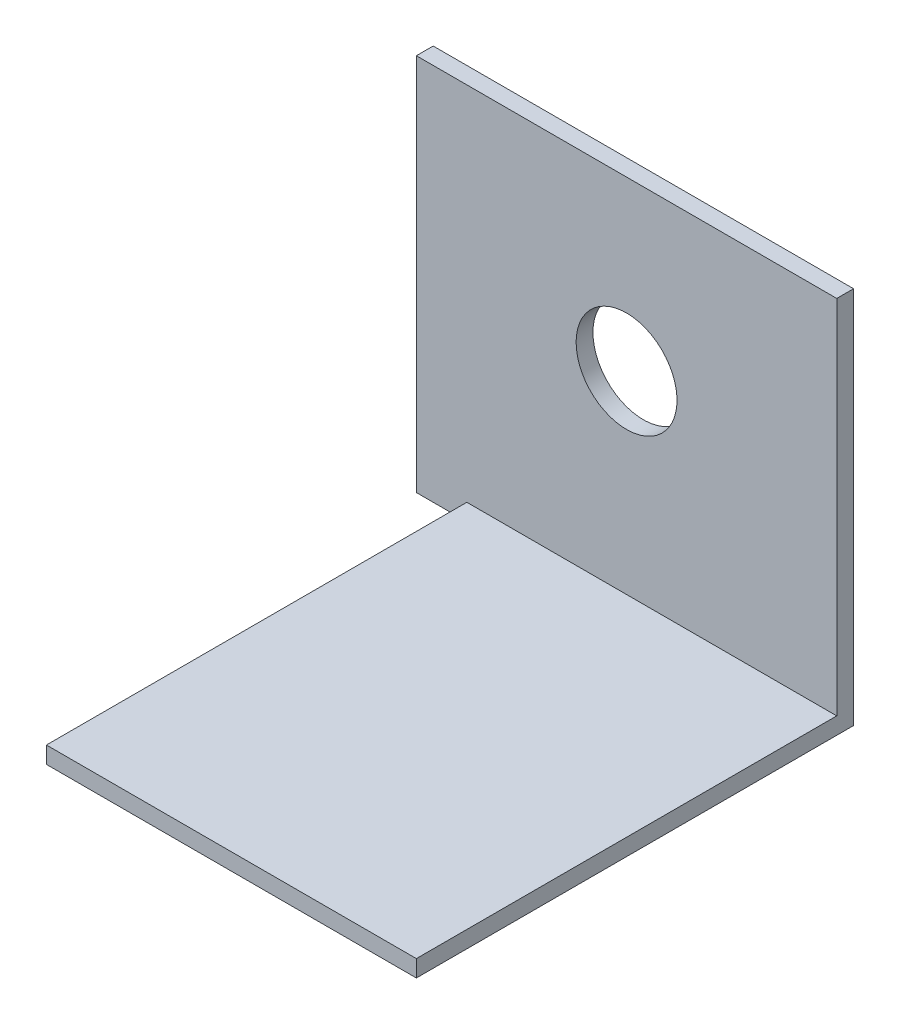
ISO-10303-21;
HEADER;
FILE_DESCRIPTION(('STEP AP214'),'2;1');
FILE_NAME('part.step','',(''),(''),'','','');
FILE_SCHEMA(('AUTOMOTIVE_DESIGN { 1 0 10303 214 1 1 1 1 }'));
ENDSEC;
DATA;
#1=APPLICATION_CONTEXT('core data for automotive mechanical design processes');
#2=APPLICATION_PROTOCOL_DEFINITION('international standard','automotive_design',2000,#1);
#3=PRODUCT_CONTEXT('',#1,'mechanical');
#4=PRODUCT('Part','Part','',(#3));
#5=PRODUCT_RELATED_PRODUCT_CATEGORY('part','',(#4));
#6=PRODUCT_DEFINITION_FORMATION('','',#4);
#7=PRODUCT_DEFINITION_CONTEXT('part definition',#1,'design');
#8=PRODUCT_DEFINITION('design','',#6,#7);
#9=PRODUCT_DEFINITION_SHAPE('','',#8);
#10=(LENGTH_UNIT() NAMED_UNIT(*) SI_UNIT(.MILLI.,.METRE.));
#11=(NAMED_UNIT(*) PLANE_ANGLE_UNIT() SI_UNIT($,.RADIAN.));
#12=(NAMED_UNIT(*) SI_UNIT($,.STERADIAN.) SOLID_ANGLE_UNIT());
#13=UNCERTAINTY_MEASURE_WITH_UNIT(LENGTH_MEASURE(1.E-05),#10,'distance_accuracy_value','');
#14=(GEOMETRIC_REPRESENTATION_CONTEXT(3) GLOBAL_UNCERTAINTY_ASSIGNED_CONTEXT((#13)) GLOBAL_UNIT_ASSIGNED_CONTEXT((#10,
#11,#12)) REPRESENTATION_CONTEXT('',''));
#15=CARTESIAN_POINT('',(0.,0.,0.));
#16=DIRECTION('',(0.,0.,1.));
#17=DIRECTION('',(1.,0.,0.));
#18=AXIS2_PLACEMENT_3D('',#15,#16,#17);
#19=CARTESIAN_POINT('',(0.,2.,0.));
#20=DIRECTION('',(1.,0.,0.));
#21=DIRECTION('',(0.,0.,-1.));
#22=AXIS2_PLACEMENT_3D('',#19,#20,#21);
#23=PLANE('',#22);
#24=DIRECTION('',(0.,0.,1.));
#25=VECTOR('',#24,1.);
#26=CARTESIAN_POINT('',(0.,0.,0.));
#27=LINE('',#26,#25);
#28=CARTESIAN_POINT('',(0.,0.,0.));
#29=VERTEX_POINT('',#28);
#30=CARTESIAN_POINT('',(0.,0.,50.));
#31=VERTEX_POINT('',#30);
#32=EDGE_CURVE('E92',#29,#31,#27,.T.);
#33=ORIENTED_EDGE('',*,*,#32,.T.);
#34=DIRECTION('',(0.,-1.,0.));
#35=VECTOR('',#34,1.);
#36=CARTESIAN_POINT('',(0.,2.,50.));
#37=LINE('',#36,#35);
#38=CARTESIAN_POINT('',(0.,2.,50.));
#39=VERTEX_POINT('',#38);
#40=EDGE_CURVE('E11',#39,#31,#37,.T.);
#41=ORIENTED_EDGE('',*,*,#40,.F.);
#42=DIRECTION('',(0.,0.,1.));
#43=VECTOR('',#42,1.);
#44=CARTESIAN_POINT('',(0.,2.,0.));
#45=LINE('',#44,#43);
#46=CARTESIAN_POINT('',(0.,2.,0.));
#47=VERTEX_POINT('',#46);
#48=EDGE_CURVE('E84',#47,#39,#45,.T.);
#49=ORIENTED_EDGE('',*,*,#48,.F.);
#50=DIRECTION('',(0.,-1.,0.));
#51=VECTOR('',#50,1.);
#52=CARTESIAN_POINT('',(0.,2.,0.));
#53=LINE('',#52,#51);
#54=EDGE_CURVE('E49',#47,#29,#53,.T.);
#55=ORIENTED_EDGE('',*,*,#54,.T.);
#56=EDGE_LOOP('',(#33,#41,#49,#55));
#57=FACE_BOUND('',#56,.T.);
#58=ADVANCED_FACE('F33',(#57),#23,.F.);
#59=CARTESIAN_POINT('',(0.,2.,50.));
#60=DIRECTION('',(0.,0.,-1.));
#61=DIRECTION('',(-1.,0.,0.));
#62=AXIS2_PLACEMENT_3D('',#59,#60,#61);
#63=PLANE('',#62);
#64=DIRECTION('',(1.,0.,0.));
#65=VECTOR('',#64,1.);
#66=CARTESIAN_POINT('',(0.,0.,50.));
#67=LINE('',#66,#65);
#68=CARTESIAN_POINT('',(44.,0.,50.));
#69=VERTEX_POINT('',#68);
#70=EDGE_CURVE('E62',#31,#69,#67,.T.);
#71=ORIENTED_EDGE('',*,*,#70,.T.);
#72=DIRECTION('',(0.,-1.,0.));
#73=VECTOR('',#72,1.);
#74=CARTESIAN_POINT('',(44.,2.,50.));
#75=LINE('',#74,#73);
#76=CARTESIAN_POINT('',(44.,2.,50.));
#77=VERTEX_POINT('',#76);
#78=EDGE_CURVE('E41',#77,#69,#75,.T.);
#79=ORIENTED_EDGE('',*,*,#78,.F.);
#80=DIRECTION('',(1.,0.,0.));
#81=VECTOR('',#80,1.);
#82=CARTESIAN_POINT('',(0.,2.,50.));
#83=LINE('',#82,#81);
#84=EDGE_CURVE('E74',#39,#77,#83,.T.);
#85=ORIENTED_EDGE('',*,*,#84,.F.);
#86=ORIENTED_EDGE('',*,*,#40,.T.);
#87=EDGE_LOOP('',(#71,#79,#85,#86));
#88=FACE_BOUND('',#87,.T.);
#89=ADVANCED_FACE('F76',(#88),#63,.F.);
#90=CARTESIAN_POINT('',(44.,2.,0.));
#91=DIRECTION('',(-1.,0.,0.));
#92=DIRECTION('',(0.,0.,1.));
#93=AXIS2_PLACEMENT_3D('',#90,#91,#92);
#94=PLANE('',#93);
#95=DIRECTION('',(0.,0.,-1.));
#96=VECTOR('',#95,1.);
#97=CARTESIAN_POINT('',(44.,0.,0.));
#98=LINE('',#97,#96);
#99=CARTESIAN_POINT('',(44.,0.,-2.));
#100=VERTEX_POINT('',#99);
#101=EDGE_CURVE('E90',#69,#100,#98,.T.);
#102=ORIENTED_EDGE('',*,*,#101,.T.);
#103=DIRECTION('',(0.,-1.,0.));
#104=VECTOR('',#103,1.);
#105=CARTESIAN_POINT('',(44.,0.,-2.));
#106=LINE('',#105,#104);
#107=CARTESIAN_POINT('',(44.,45.,-2.));
#108=VERTEX_POINT('',#107);
#109=EDGE_CURVE('E122',#108,#100,#106,.T.);
#110=ORIENTED_EDGE('',*,*,#109,.F.);
#111=DIRECTION('',(0.,0.,1.));
#112=VECTOR('',#111,1.);
#113=CARTESIAN_POINT('',(44.,45.,-2.));
#114=LINE('',#113,#112);
#115=CARTESIAN_POINT('',(44.,45.,0.));
#116=VERTEX_POINT('',#115);
#117=EDGE_CURVE('E142',#108,#116,#114,.T.);
#118=ORIENTED_EDGE('',*,*,#117,.T.);
#119=DIRECTION('',(0.,-1.,0.));
#120=VECTOR('',#119,1.);
#121=CARTESIAN_POINT('',(44.,0.,0.));
#122=LINE('',#121,#120);
#123=CARTESIAN_POINT('',(44.,2.,0.));
#124=VERTEX_POINT('',#123);
#125=EDGE_CURVE('E143',#116,#124,#122,.T.);
#126=ORIENTED_EDGE('',*,*,#125,.T.);
#127=DIRECTION('',(0.,0.,-1.));
#128=VECTOR('',#127,1.);
#129=CARTESIAN_POINT('',(44.,2.,0.));
#130=LINE('',#129,#128);
#131=EDGE_CURVE('E83',#77,#124,#130,.T.);
#132=ORIENTED_EDGE('',*,*,#131,.F.);
#133=ORIENTED_EDGE('',*,*,#78,.T.);
#134=EDGE_LOOP('',(#102,#110,#118,#126,#132,#133));
#135=FACE_BOUND('',#134,.T.);
#136=ADVANCED_FACE('F105',(#135),#94,.F.);
#137=CARTESIAN_POINT('',(0.,2.,0.));
#138=DIRECTION('',(0.,1.,0.));
#139=DIRECTION('',(0.,0.,1.));
#140=AXIS2_PLACEMENT_3D('',#137,#138,#139);
#141=PLANE('',#140);
#142=ORIENTED_EDGE('',*,*,#48,.T.);
#143=ORIENTED_EDGE('',*,*,#84,.T.);
#144=ORIENTED_EDGE('',*,*,#131,.T.);
#145=DIRECTION('',(-1.,0.,0.));
#146=VECTOR('',#145,1.);
#147=CARTESIAN_POINT('',(0.,2.,0.));
#148=LINE('',#147,#146);
#149=EDGE_CURVE('E88',#124,#47,#148,.T.);
#150=ORIENTED_EDGE('',*,*,#149,.T.);
#151=EDGE_LOOP('',(#142,#143,#144,#150));
#152=FACE_BOUND('',#151,.T.);
#153=ADVANCED_FACE('F87',(#152),#141,.T.);
#154=CARTESIAN_POINT('',(0.,0.,0.));
#155=DIRECTION('',(0.,1.,0.));
#156=DIRECTION('',(0.,0.,1.));
#157=AXIS2_PLACEMENT_3D('',#154,#155,#156);
#158=PLANE('',#157);
#159=ORIENTED_EDGE('',*,*,#32,.F.);
#160=DIRECTION('',(-1.,0.,0.));
#161=VECTOR('',#160,1.);
#162=CARTESIAN_POINT('',(44.,0.,0.));
#163=LINE('',#162,#161);
#164=CARTESIAN_POINT('',(-6.00000000000002,0.,0.));
#165=VERTEX_POINT('',#164);
#166=EDGE_CURVE('E67',#29,#165,#163,.T.);
#167=ORIENTED_EDGE('',*,*,#166,.T.);
#168=DIRECTION('',(0.,0.,1.));
#169=VECTOR('',#168,1.);
#170=CARTESIAN_POINT('',(-6.00000000000002,0.,-2.));
#171=LINE('',#170,#169);
#172=CARTESIAN_POINT('',(-6.00000000000002,0.,-2.));
#173=VERTEX_POINT('',#172);
#174=EDGE_CURVE('E93',#173,#165,#171,.T.);
#175=ORIENTED_EDGE('',*,*,#174,.F.);
#176=DIRECTION('',(-1.,0.,0.));
#177=VECTOR('',#176,1.);
#178=CARTESIAN_POINT('',(44.,0.,-2.));
#179=LINE('',#178,#177);
#180=EDGE_CURVE('E113',#100,#173,#179,.T.);
#181=ORIENTED_EDGE('',*,*,#180,.F.);
#182=ORIENTED_EDGE('',*,*,#101,.F.);
#183=ORIENTED_EDGE('',*,*,#70,.F.);
#184=EDGE_LOOP('',(#159,#167,#175,#181,#182,#183));
#185=FACE_BOUND('',#184,.T.);
#186=ADVANCED_FACE('F110',(#185),#158,.F.);
#187=CARTESIAN_POINT('',(0.,0.,0.));
#188=DIRECTION('',(0.,0.,1.));
#189=DIRECTION('',(1.,0.,0.));
#190=AXIS2_PLACEMENT_3D('',#187,#188,#189);
#191=PLANE('',#190);
#192=CARTESIAN_POINT('',(19.,25.,0.));
#193=DIRECTION('',(0.,0.,-1.));
#194=DIRECTION('',(-1.,0.,0.));
#195=AXIS2_PLACEMENT_3D('',#192,#193,#194);
#196=CIRCLE('',#195,6.);
#197=CARTESIAN_POINT('',(13.,25.,0.));
#198=VERTEX_POINT('',#197);
#199=EDGE_CURVE('E137',#198,#198,#196,.T.);
#200=ORIENTED_EDGE('',*,*,#199,.T.);
#201=EDGE_LOOP('',(#200));
#202=FACE_BOUND('',#201,.T.);
#203=ORIENTED_EDGE('',*,*,#54,.F.);
#204=ORIENTED_EDGE('',*,*,#149,.F.);
#205=ORIENTED_EDGE('',*,*,#125,.F.);
#206=DIRECTION('',(1.,0.,0.));
#207=VECTOR('',#206,1.);
#208=CARTESIAN_POINT('',(44.,45.,0.));
#209=LINE('',#208,#207);
#210=CARTESIAN_POINT('',(-6.00000000000001,45.,0.));
#211=VERTEX_POINT('',#210);
#212=EDGE_CURVE('E131',#211,#116,#209,.T.);
#213=ORIENTED_EDGE('',*,*,#212,.F.);
#214=DIRECTION('',(0.,1.,0.));
#215=VECTOR('',#214,1.);
#216=CARTESIAN_POINT('',(-6.00000000000002,0.,0.));
#217=LINE('',#216,#215);
#218=EDGE_CURVE('E134',#165,#211,#217,.T.);
#219=ORIENTED_EDGE('',*,*,#218,.F.);
#220=ORIENTED_EDGE('',*,*,#166,.F.);
#221=EDGE_LOOP('',(#203,#204,#205,#213,#219,#220));
#222=FACE_BOUND('',#221,.T.);
#223=ADVANCED_FACE('F161',(#202,#222),#191,.T.);
#224=CARTESIAN_POINT('',(0.,0.,-2.));
#225=DIRECTION('',(0.,0.,1.));
#226=DIRECTION('',(1.,0.,0.));
#227=AXIS2_PLACEMENT_3D('',#224,#225,#226);
#228=PLANE('',#227);
#229=ORIENTED_EDGE('',*,*,#109,.T.);
#230=ORIENTED_EDGE('',*,*,#180,.T.);
#231=DIRECTION('',(0.,1.,0.));
#232=VECTOR('',#231,1.);
#233=CARTESIAN_POINT('',(-6.00000000000002,0.,-2.));
#234=LINE('',#233,#232);
#235=CARTESIAN_POINT('',(-6.00000000000001,45.,-2.));
#236=VERTEX_POINT('',#235);
#237=EDGE_CURVE('E121',#173,#236,#234,.T.);
#238=ORIENTED_EDGE('',*,*,#237,.T.);
#239=DIRECTION('',(1.,0.,0.));
#240=VECTOR('',#239,1.);
#241=CARTESIAN_POINT('',(44.,45.,-2.));
#242=LINE('',#241,#240);
#243=EDGE_CURVE('E128',#236,#108,#242,.T.);
#244=ORIENTED_EDGE('',*,*,#243,.T.);
#245=EDGE_LOOP('',(#229,#230,#238,#244));
#246=FACE_BOUND('',#245,.T.);
#247=CARTESIAN_POINT('',(19.,25.,-2.));
#248=DIRECTION('',(0.,0.,-1.));
#249=DIRECTION('',(-1.,0.,0.));
#250=AXIS2_PLACEMENT_3D('',#247,#248,#249);
#251=CIRCLE('',#250,6.);
#252=CARTESIAN_POINT('',(13.,25.,-2.));
#253=VERTEX_POINT('',#252);
#254=EDGE_CURVE('E145',#253,#253,#251,.T.);
#255=ORIENTED_EDGE('',*,*,#254,.F.);
#256=EDGE_LOOP('',(#255));
#257=FACE_BOUND('',#256,.T.);
#258=ADVANCED_FACE('F125',(#246,#257),#228,.F.);
#259=CARTESIAN_POINT('',(-6.00000000000002,0.,-2.));
#260=DIRECTION('',(1.,0.,0.));
#261=DIRECTION('',(0.,1.,0.));
#262=AXIS2_PLACEMENT_3D('',#259,#260,#261);
#263=PLANE('',#262);
#264=ORIENTED_EDGE('',*,*,#218,.T.);
#265=DIRECTION('',(0.,0.,1.));
#266=VECTOR('',#265,1.);
#267=CARTESIAN_POINT('',(-6.00000000000001,45.,-2.));
#268=LINE('',#267,#266);
#269=EDGE_CURVE('E97',#236,#211,#268,.T.);
#270=ORIENTED_EDGE('',*,*,#269,.F.);
#271=ORIENTED_EDGE('',*,*,#237,.F.);
#272=ORIENTED_EDGE('',*,*,#174,.T.);
#273=EDGE_LOOP('',(#264,#270,#271,#272));
#274=FACE_BOUND('',#273,.T.);
#275=ADVANCED_FACE('F166',(#274),#263,.F.);
#276=CARTESIAN_POINT('',(44.,45.,-2.));
#277=DIRECTION('',(0.,-1.,0.));
#278=DIRECTION('',(1.,0.,0.));
#279=AXIS2_PLACEMENT_3D('',#276,#277,#278);
#280=PLANE('',#279);
#281=ORIENTED_EDGE('',*,*,#212,.T.);
#282=ORIENTED_EDGE('',*,*,#117,.F.);
#283=ORIENTED_EDGE('',*,*,#243,.F.);
#284=ORIENTED_EDGE('',*,*,#269,.T.);
#285=EDGE_LOOP('',(#281,#282,#283,#284));
#286=FACE_BOUND('',#285,.T.);
#287=ADVANCED_FACE('F155',(#286),#280,.F.);
#288=CARTESIAN_POINT('',(19.,25.,-2.));
#289=DIRECTION('',(0.,0.,1.));
#290=DIRECTION('',(1.,0.,0.));
#291=AXIS2_PLACEMENT_3D('',#288,#289,#290);
#292=CYLINDRICAL_SURFACE('',#291,6.);
#293=ORIENTED_EDGE('',*,*,#254,.T.);
#294=EDGE_LOOP('',(#293));
#295=FACE_BOUND('',#294,.T.);
#296=ORIENTED_EDGE('',*,*,#199,.F.);
#297=EDGE_LOOP('',(#296));
#298=FACE_BOUND('',#297,.T.);
#299=ADVANCED_FACE('F173',(#295,#298),#292,.F.);
#300=CLOSED_SHELL('',(#58,#89,#136,#153,#186,#223,#258,#275,#287,#299));
#301=MANIFOLD_SOLID_BREP('B2',#300);
#302=ADVANCED_BREP_SHAPE_REPRESENTATION('',(#18,#301),#14);
#303=SHAPE_DEFINITION_REPRESENTATION(#9,#302);
ENDSEC;
END-ISO-10303-21;
